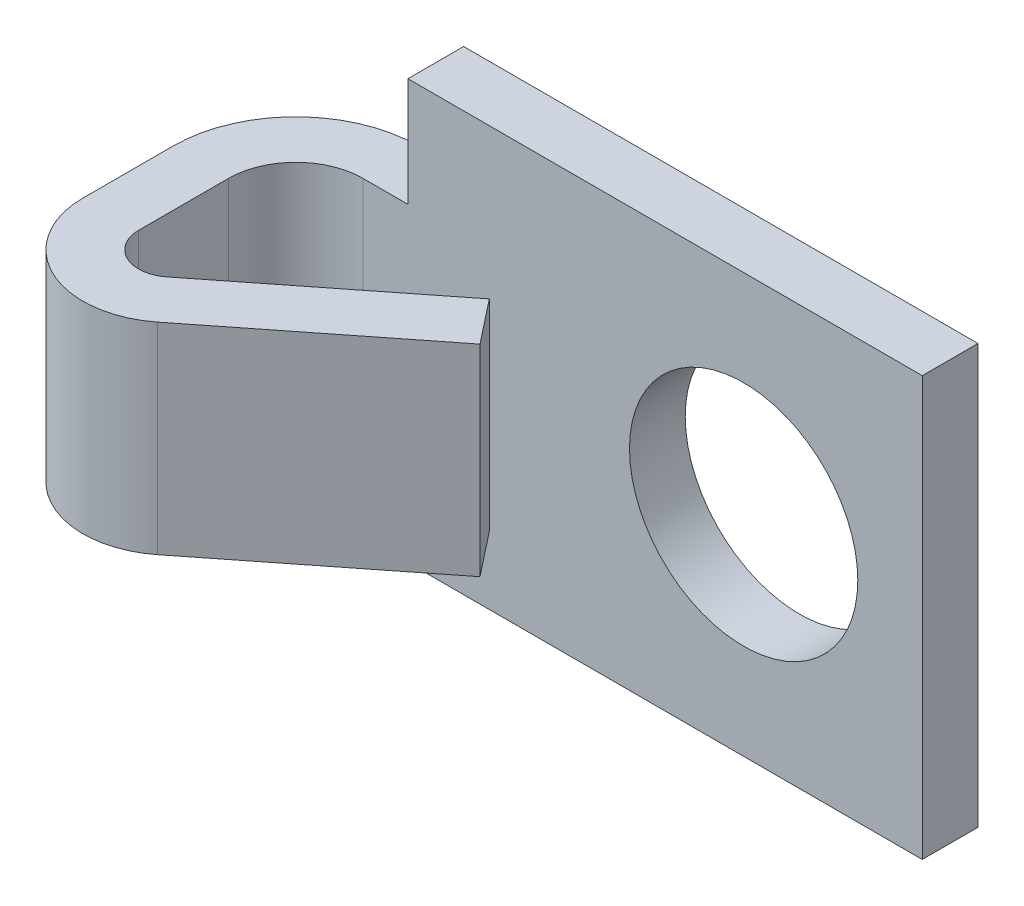
ISO-10303-21;
HEADER;
FILE_DESCRIPTION(('STEP AP214'),'2;1');
FILE_NAME('part.step','',(''),(''),'','','');
FILE_SCHEMA(('AUTOMOTIVE_DESIGN { 1 0 10303 214 1 1 1 1 }'));
ENDSEC;
DATA;
#1=APPLICATION_CONTEXT('core data for automotive mechanical design processes');
#2=APPLICATION_PROTOCOL_DEFINITION('international standard','automotive_design',2000,#1);
#3=PRODUCT_CONTEXT('',#1,'mechanical');
#4=PRODUCT('Part','Part','',(#3));
#5=PRODUCT_RELATED_PRODUCT_CATEGORY('part','',(#4));
#6=PRODUCT_DEFINITION_FORMATION('','',#4);
#7=PRODUCT_DEFINITION_CONTEXT('part definition',#1,'design');
#8=PRODUCT_DEFINITION('design','',#6,#7);
#9=PRODUCT_DEFINITION_SHAPE('','',#8);
#10=(LENGTH_UNIT() NAMED_UNIT(*) SI_UNIT(.MILLI.,.METRE.));
#11=(NAMED_UNIT(*) PLANE_ANGLE_UNIT() SI_UNIT($,.RADIAN.));
#12=(NAMED_UNIT(*) SI_UNIT($,.STERADIAN.) SOLID_ANGLE_UNIT());
#13=UNCERTAINTY_MEASURE_WITH_UNIT(LENGTH_MEASURE(1.E-05),#10,'distance_accuracy_value','');
#14=(GEOMETRIC_REPRESENTATION_CONTEXT(3) GLOBAL_UNCERTAINTY_ASSIGNED_CONTEXT((#13)) GLOBAL_UNIT_ASSIGNED_CONTEXT((#10,
#11,#12)) REPRESENTATION_CONTEXT('',''));
#15=CARTESIAN_POINT('',(0.,0.,0.));
#16=DIRECTION('',(0.,0.,1.));
#17=DIRECTION('',(1.,0.,0.));
#18=AXIS2_PLACEMENT_3D('',#15,#16,#17);
#19=CARTESIAN_POINT('',(-15.6718,-3.81000000000006,8.05180000000003));
#20=DIRECTION('',(0.,1.,0.));
#21=DIRECTION('',(0.,0.,1.));
#22=AXIS2_PLACEMENT_3D('',#19,#20,#21);
#23=CYLINDRICAL_SURFACE('',#22,1.27);
#24=CARTESIAN_POINT('',(-15.6718,-3.81000000000006,8.05180000000003));
#25=DIRECTION('',(0.,1.,0.));
#26=DIRECTION('',(0.,0.,1.));
#27=AXIS2_PLACEMENT_3D('',#24,#25,#26);
#28=CIRCLE('',#27,1.27);
#29=CARTESIAN_POINT('',(-16.9418000000001,-3.81000000000006,8.05180000000003));
#30=VERTEX_POINT('',#29);
#31=CARTESIAN_POINT('',(-14.8854939044228,-3.81000000000006,9.04910773789144));
#32=VERTEX_POINT('',#31);
#33=EDGE_CURVE('E157',#30,#32,#28,.T.);
#34=ORIENTED_EDGE('',*,*,#33,.F.);
#35=DIRECTION('',(0.,-1.,0.));
#36=VECTOR('',#35,1.);
#37=CARTESIAN_POINT('',(-16.9418000000001,3.80999999999992,8.05180000000008));
#38=LINE('',#37,#36);
#39=CARTESIAN_POINT('',(-16.9418000000001,3.80999999999991,8.05180000000008));
#40=VERTEX_POINT('',#39);
#41=EDGE_CURVE('E182',#40,#30,#38,.T.);
#42=ORIENTED_EDGE('',*,*,#41,.F.);
#43=CARTESIAN_POINT('',(-15.6718,3.8099999999999,8.05180000000008));
#44=DIRECTION('',(0.,1.,0.));
#45=DIRECTION('',(0.,0.,1.));
#46=AXIS2_PLACEMENT_3D('',#43,#44,#45);
#47=CIRCLE('',#46,1.27);
#48=CARTESIAN_POINT('',(-14.8854939044228,3.80999999999989,9.04910773789149));
#49=VERTEX_POINT('',#48);
#50=EDGE_CURVE('E189',#49,#40,#47,.F.);
#51=ORIENTED_EDGE('',*,*,#50,.F.);
#52=DIRECTION('',(0.,1.,0.));
#53=VECTOR('',#52,1.);
#54=CARTESIAN_POINT('',(-14.8854939044228,-3.81000000000006,9.04910773789143));
#55=LINE('',#54,#53);
#56=EDGE_CURVE('E38',#32,#49,#55,.T.);
#57=ORIENTED_EDGE('',*,*,#56,.F.);
#58=EDGE_LOOP('',(#34,#42,#51,#57));
#59=FACE_BOUND('',#58,.T.);
#60=ADVANCED_FACE('F34',(#59),#23,.F.);
#61=CARTESIAN_POINT('',(-14.8854939044228,-3.81000000000006,9.04910773789143));
#62=DIRECTION('',(-0.619138657934842,0.,-0.785281683379055));
#63=DIRECTION('',(0.,1.,0.));
#64=AXIS2_PLACEMENT_3D('',#61,#62,#63);
#65=PLANE('',#64);
#66=DIRECTION('',(0.785281683379055,0.,-0.619138657934842));
#67=VECTOR('',#66,1.);
#68=CARTESIAN_POINT('',(-14.8854939044228,-3.81000000000006,9.04910773789144));
#69=LINE('',#68,#67);
#70=CARTESIAN_POINT('',(-8.06166811865821,-3.81000000000003,3.66900728680263));
#71=VERTEX_POINT('',#70);
#72=EDGE_CURVE('E148',#32,#71,#69,.T.);
#73=ORIENTED_EDGE('',*,*,#72,.F.);
#74=ORIENTED_EDGE('',*,*,#56,.T.);
#75=DIRECTION('',(-0.785281683379055,0.,0.619138657934842));
#76=VECTOR('',#75,1.);
#77=CARTESIAN_POINT('',(-8.0616681186582,3.80999999999994,3.66900728680267));
#78=LINE('',#77,#76);
#79=CARTESIAN_POINT('',(-8.06166811865821,3.80999999999994,3.66900728680268));
#80=VERTEX_POINT('',#79);
#81=EDGE_CURVE('E164',#80,#49,#78,.T.);
#82=ORIENTED_EDGE('',*,*,#81,.F.);
#83=DIRECTION('',(0.,-1.,0.));
#84=VECTOR('',#83,1.);
#85=CARTESIAN_POINT('',(-8.06166811865821,3.80999999999995,3.66900728680268));
#86=LINE('',#85,#84);
#87=EDGE_CURVE('E161',#71,#80,#86,.F.);
#88=ORIENTED_EDGE('',*,*,#87,.F.);
#89=EDGE_LOOP('',(#73,#74,#82,#88));
#90=FACE_BOUND('',#89,.T.);
#91=ADVANCED_FACE('F162',(#90),#65,.T.);
#92=CARTESIAN_POINT('',(-6.7564,3.80999999999994,5.32453813170244));
#93=DIRECTION('',(0.785281683379066,0.,-0.619138657934828));
#94=DIRECTION('',(0.,-1.,0.));
#95=AXIS2_PLACEMENT_3D('',#92,#93,#94);
#96=PLANE('',#95);
#97=DIRECTION('',(0.619138657934827,0.,0.785281683379066));
#98=VECTOR('',#97,1.);
#99=CARTESIAN_POINT('',(-8.06166811865821,-3.81000000000003,3.66900728680263));
#100=LINE('',#99,#98);
#101=CARTESIAN_POINT('',(-6.7564,-3.81000000000004,5.32453813170239));
#102=VERTEX_POINT('',#101);
#103=EDGE_CURVE('E153',#71,#102,#100,.T.);
#104=ORIENTED_EDGE('',*,*,#103,.F.);
#105=ORIENTED_EDGE('',*,*,#87,.T.);
#106=DIRECTION('',(-0.619138657934828,0.,-0.785281683379066));
#107=VECTOR('',#106,1.);
#108=CARTESIAN_POINT('',(-6.75640000000001,3.80999999999993,5.32453813170244));
#109=LINE('',#108,#107);
#110=CARTESIAN_POINT('',(-6.7564,3.80999999999993,5.32453813170244));
#111=VERTEX_POINT('',#110);
#112=EDGE_CURVE('E192',#111,#80,#109,.T.);
#113=ORIENTED_EDGE('',*,*,#112,.F.);
#114=DIRECTION('',(0.,-1.,0.));
#115=VECTOR('',#114,1.);
#116=CARTESIAN_POINT('',(-6.7564,3.80999999999994,5.32453813170244));
#117=LINE('',#116,#115);
#118=EDGE_CURVE('E168',#102,#111,#117,.F.);
#119=ORIENTED_EDGE('',*,*,#118,.F.);
#120=EDGE_LOOP('',(#104,#105,#113,#119));
#121=FACE_BOUND('',#120,.T.);
#122=ADVANCED_FACE('F169',(#121),#96,.T.);
#123=CARTESIAN_POINT('',(-13.5802257857645,3.8099999999999,10.7046385827912));
#124=DIRECTION('',(0.619138657934841,0.,0.785281683379056));
#125=DIRECTION('',(0.,-1.,0.));
#126=AXIS2_PLACEMENT_3D('',#123,#124,#125);
#127=PLANE('',#126);
#128=DIRECTION('',(-0.785281683379056,0.,0.619138657934841));
#129=VECTOR('',#128,1.);
#130=CARTESIAN_POINT('',(-6.7564,-3.81000000000004,5.32453813170238));
#131=LINE('',#130,#129);
#132=CARTESIAN_POINT('',(-13.5802257857645,-3.81000000000008,10.7046385827912));
#133=VERTEX_POINT('',#132);
#134=EDGE_CURVE('E171',#102,#133,#131,.T.);
#135=ORIENTED_EDGE('',*,*,#134,.F.);
#136=ORIENTED_EDGE('',*,*,#118,.T.);
#137=DIRECTION('',(0.785281683379056,0.,-0.619138657934841));
#138=VECTOR('',#137,1.);
#139=CARTESIAN_POINT('',(-13.5802257857645,3.80999999999988,10.7046385827912));
#140=LINE('',#139,#138);
#141=CARTESIAN_POINT('',(-13.5802257857645,3.80999999999988,10.7046385827912));
#142=VERTEX_POINT('',#141);
#143=EDGE_CURVE('E194',#142,#111,#140,.T.);
#144=ORIENTED_EDGE('',*,*,#143,.F.);
#145=DIRECTION('',(0.,-1.,0.));
#146=VECTOR('',#145,1.);
#147=CARTESIAN_POINT('',(-13.5802257857646,3.8099999999999,10.7046385827912));
#148=LINE('',#147,#146);
#149=EDGE_CURVE('E207',#133,#142,#148,.F.);
#150=ORIENTED_EDGE('',*,*,#149,.F.);
#151=EDGE_LOOP('',(#135,#136,#144,#150));
#152=FACE_BOUND('',#151,.T.);
#153=ADVANCED_FACE('F213',(#152),#127,.T.);
#154=CARTESIAN_POINT('',(-15.6718,3.80999999999992,8.05180000000008));
#155=DIRECTION('',(0.,-1.,0.));
#156=DIRECTION('',(0.,0.,-1.));
#157=AXIS2_PLACEMENT_3D('',#154,#155,#156);
#158=CYLINDRICAL_SURFACE('',#157,3.3782);
#159=CARTESIAN_POINT('',(-15.6718,-3.81000000000006,8.05180000000003));
#160=DIRECTION('',(0.,-1.,0.));
#161=DIRECTION('',(0.,0.,-1.));
#162=AXIS2_PLACEMENT_3D('',#159,#160,#161);
#163=CIRCLE('',#162,3.3782);
#164=CARTESIAN_POINT('',(-19.05,-3.81000000000006,8.05180000000003));
#165=VERTEX_POINT('',#164);
#166=EDGE_CURVE('E173',#133,#165,#163,.T.);
#167=ORIENTED_EDGE('',*,*,#166,.F.);
#168=ORIENTED_EDGE('',*,*,#149,.T.);
#169=CARTESIAN_POINT('',(-15.6718,3.8099999999999,8.05180000000008));
#170=DIRECTION('',(0.,-1.,0.));
#171=DIRECTION('',(0.,0.,-1.));
#172=AXIS2_PLACEMENT_3D('',#169,#170,#171);
#173=CIRCLE('',#172,3.3782);
#174=CARTESIAN_POINT('',(-19.05,3.8099999999999,8.05180000000008));
#175=VERTEX_POINT('',#174);
#176=EDGE_CURVE('E197',#175,#142,#173,.F.);
#177=ORIENTED_EDGE('',*,*,#176,.F.);
#178=DIRECTION('',(0.,1.,0.));
#179=VECTOR('',#178,1.);
#180=CARTESIAN_POINT('',(-19.05,-3.81000000000006,8.05180000000003));
#181=LINE('',#180,#179);
#182=EDGE_CURVE('E205',#165,#175,#181,.T.);
#183=ORIENTED_EDGE('',*,*,#182,.F.);
#184=EDGE_LOOP('',(#167,#168,#177,#183));
#185=FACE_BOUND('',#184,.T.);
#186=ADVANCED_FACE('F222',(#185),#158,.T.);
#187=CARTESIAN_POINT('',(-19.05,-3.81000000000006,8.05180000000003));
#188=DIRECTION('',(-1.,0.,0.));
#189=DIRECTION('',(0.,1.,0.));
#190=AXIS2_PLACEMENT_3D('',#187,#188,#189);
#191=PLANE('',#190);
#192=DIRECTION('',(0.,0.,-1.));
#193=VECTOR('',#192,1.);
#194=CARTESIAN_POINT('',(-19.05,-3.81000000000008,11.5937097155975));
#195=LINE('',#194,#193);
#196=CARTESIAN_POINT('',(-19.05,-3.81000000000003,4.64819999999997));
#197=VERTEX_POINT('',#196);
#198=EDGE_CURVE('E225',#165,#197,#195,.T.);
#199=ORIENTED_EDGE('',*,*,#198,.F.);
#200=ORIENTED_EDGE('',*,*,#182,.T.);
#201=DIRECTION('',(0.,0.,-1.));
#202=VECTOR('',#201,1.);
#203=CARTESIAN_POINT('',(-19.05,3.80999999999987,11.5443000000001));
#204=LINE('',#203,#202);
#205=CARTESIAN_POINT('',(-19.05,3.80999999999993,4.64820000000003));
#206=VERTEX_POINT('',#205);
#207=EDGE_CURVE('E200',#206,#175,#204,.F.);
#208=ORIENTED_EDGE('',*,*,#207,.F.);
#209=DIRECTION('',(0.,-1.,0.));
#210=VECTOR('',#209,1.);
#211=CARTESIAN_POINT('',(-19.05,3.80999999999994,4.64820000000003));
#212=LINE('',#211,#210);
#213=EDGE_CURVE('E236',#197,#206,#212,.F.);
#214=ORIENTED_EDGE('',*,*,#213,.F.);
#215=EDGE_LOOP('',(#199,#200,#208,#214));
#216=FACE_BOUND('',#215,.T.);
#217=ADVANCED_FACE('F371',(#216),#191,.T.);
#218=CARTESIAN_POINT('',(-19.05,3.80999999999987,11.5443000000001));
#219=DIRECTION('',(0.,1.,0.));
#220=DIRECTION('',(1.,0.,0.));
#221=AXIS2_PLACEMENT_3D('',#218,#219,#220);
#222=PLANE('',#221);
#223=CARTESIAN_POINT('',(-14.4018000000001,3.80999999999994,4.64820000000003));
#224=DIRECTION('',(0.,1.,0.));
#225=DIRECTION('',(0.,0.,1.));
#226=AXIS2_PLACEMENT_3D('',#223,#224,#225);
#227=CIRCLE('',#226,2.54);
#228=CARTESIAN_POINT('',(-14.4018000000001,3.80999999999996,2.10820000000004));
#229=VERTEX_POINT('',#228);
#230=CARTESIAN_POINT('',(-16.9418000000001,3.80999999999994,4.64820000000004));
#231=VERTEX_POINT('',#230);
#232=EDGE_CURVE('E244',#229,#231,#227,.T.);
#233=ORIENTED_EDGE('',*,*,#232,.F.);
#234=DIRECTION('',(1.,0.,0.));
#235=VECTOR('',#234,1.);
#236=CARTESIAN_POINT('',(-19.05,3.80999999999996,2.10820000000004));
#237=LINE('',#236,#235);
#238=CARTESIAN_POINT('',(-12.7,3.80999999999996,2.10820000000004));
#239=VERTEX_POINT('',#238);
#240=EDGE_CURVE('E187',#229,#239,#237,.T.);
#241=ORIENTED_EDGE('',*,*,#240,.T.);
#242=DIRECTION('',(0.,0.,-1.));
#243=VECTOR('',#242,1.);
#244=CARTESIAN_POINT('',(-12.7,3.80999999999996,2.10820000000003));
#245=LINE('',#244,#243);
#246=CARTESIAN_POINT('',(-12.7,3.80999999999998,0.));
#247=VERTEX_POINT('',#246);
#248=EDGE_CURVE('E241',#247,#239,#245,.F.);
#249=ORIENTED_EDGE('',*,*,#248,.F.);
#250=DIRECTION('',(1.,0.,0.));
#251=VECTOR('',#250,1.);
#252=CARTESIAN_POINT('',(-19.05,3.80999999999998,0.));
#253=LINE('',#252,#251);
#254=CARTESIAN_POINT('',(-14.4018,3.80999999999997,0.));
#255=VERTEX_POINT('',#254);
#256=EDGE_CURVE('E203',#247,#255,#253,.F.);
#257=ORIENTED_EDGE('',*,*,#256,.T.);
#258=CARTESIAN_POINT('',(-14.4018,3.80999999999993,4.64820000000003));
#259=DIRECTION('',(0.,-1.,0.));
#260=DIRECTION('',(0.,0.,-1.));
#261=AXIS2_PLACEMENT_3D('',#258,#259,#260);
#262=CIRCLE('',#261,4.6482);
#263=EDGE_CURVE('E230',#206,#255,#262,.T.);
#264=ORIENTED_EDGE('',*,*,#263,.F.);
#265=ORIENTED_EDGE('',*,*,#207,.T.);
#266=ORIENTED_EDGE('',*,*,#176,.T.);
#267=ORIENTED_EDGE('',*,*,#143,.T.);
#268=ORIENTED_EDGE('',*,*,#112,.T.);
#269=ORIENTED_EDGE('',*,*,#81,.T.);
#270=ORIENTED_EDGE('',*,*,#50,.T.);
#271=DIRECTION('',(0.,0.,-1.));
#272=VECTOR('',#271,1.);
#273=CARTESIAN_POINT('',(-16.9418000000001,3.80999999999991,8.05180000000008));
#274=LINE('',#273,#272);
#275=EDGE_CURVE('E184',#231,#40,#274,.F.);
#276=ORIENTED_EDGE('',*,*,#275,.F.);
#277=EDGE_LOOP('',(#233,#241,#249,#257,#264,#265,#266,#267,#268,#269,#270,#276));
#278=FACE_BOUND('',#277,.T.);
#279=ADVANCED_FACE('F217',(#278),#222,.T.);
#280=CARTESIAN_POINT('',(-16.9418000000001,3.80999999999992,8.05180000000008));
#281=DIRECTION('',(1.,0.,0.));
#282=DIRECTION('',(0.,-1.,0.));
#283=AXIS2_PLACEMENT_3D('',#280,#281,#282);
#284=PLANE('',#283);
#285=DIRECTION('',(0.,0.,-1.));
#286=VECTOR('',#285,1.);
#287=CARTESIAN_POINT('',(-16.9418000000001,-3.81000000000008,11.5937097155975));
#288=LINE('',#287,#286);
#289=CARTESIAN_POINT('',(-16.9418000000001,-3.81000000000003,4.64819999999997));
#290=VERTEX_POINT('',#289);
#291=EDGE_CURVE('E178',#290,#30,#288,.F.);
#292=ORIENTED_EDGE('',*,*,#291,.F.);
#293=DIRECTION('',(0.,1.,0.));
#294=VECTOR('',#293,1.);
#295=CARTESIAN_POINT('',(-16.9418000000001,-3.81000000000003,4.64819999999998));
#296=LINE('',#295,#294);
#297=EDGE_CURVE('E247',#231,#290,#296,.F.);
#298=ORIENTED_EDGE('',*,*,#297,.F.);
#299=ORIENTED_EDGE('',*,*,#275,.T.);
#300=ORIENTED_EDGE('',*,*,#41,.T.);
#301=EDGE_LOOP('',(#292,#298,#299,#300));
#302=FACE_BOUND('',#301,.T.);
#303=ADVANCED_FACE('F326',(#302),#284,.T.);
#304=CARTESIAN_POINT('',(-6.7564,-3.81000000000008,11.5937097155975));
#305=DIRECTION('',(0.,-1.,0.));
#306=DIRECTION('',(-1.,0.,0.));
#307=AXIS2_PLACEMENT_3D('',#304,#305,#306);
#308=PLANE('',#307);
#309=CARTESIAN_POINT('',(-14.4018,-3.81000000000003,4.64819999999997));
#310=DIRECTION('',(0.,-1.,0.));
#311=DIRECTION('',(0.,0.,-1.));
#312=AXIS2_PLACEMENT_3D('',#309,#310,#311);
#313=CIRCLE('',#312,4.6482);
#314=CARTESIAN_POINT('',(-14.4018,-3.81,0.));
#315=VERTEX_POINT('',#314);
#316=EDGE_CURVE('E233',#315,#197,#313,.F.);
#317=ORIENTED_EDGE('',*,*,#316,.F.);
#318=DIRECTION('',(-1.,0.,0.));
#319=VECTOR('',#318,1.);
#320=CARTESIAN_POINT('',(-6.7564,-3.81,0.));
#321=LINE('',#320,#319);
#322=CARTESIAN_POINT('',(-12.7,-3.81,0.));
#323=VERTEX_POINT('',#322);
#324=EDGE_CURVE('E226',#315,#323,#321,.F.);
#325=ORIENTED_EDGE('',*,*,#324,.T.);
#326=DIRECTION('',(0.,0.,-1.));
#327=VECTOR('',#326,1.);
#328=CARTESIAN_POINT('',(-12.7,-3.81000000000002,2.10819999999997));
#329=LINE('',#328,#327);
#330=CARTESIAN_POINT('',(-12.7,-3.81000000000002,2.10819999999998));
#331=VERTEX_POINT('',#330);
#332=EDGE_CURVE('E253',#331,#323,#329,.T.);
#333=ORIENTED_EDGE('',*,*,#332,.F.);
#334=DIRECTION('',(-1.,0.,0.));
#335=VECTOR('',#334,1.);
#336=CARTESIAN_POINT('',(-6.7564,-3.81000000000002,2.10819999999998));
#337=LINE('',#336,#335);
#338=CARTESIAN_POINT('',(-14.4018000000001,-3.81000000000002,2.10819999999998));
#339=VERTEX_POINT('',#338);
#340=EDGE_CURVE('E180',#331,#339,#337,.T.);
#341=ORIENTED_EDGE('',*,*,#340,.T.);
#342=CARTESIAN_POINT('',(-14.4018000000001,-3.81000000000003,4.64819999999997));
#343=DIRECTION('',(0.,1.,0.));
#344=DIRECTION('',(0.,0.,1.));
#345=AXIS2_PLACEMENT_3D('',#342,#343,#344);
#346=CIRCLE('',#345,2.54);
#347=EDGE_CURVE('E250',#290,#339,#346,.F.);
#348=ORIENTED_EDGE('',*,*,#347,.F.);
#349=ORIENTED_EDGE('',*,*,#291,.T.);
#350=ORIENTED_EDGE('',*,*,#33,.T.);
#351=ORIENTED_EDGE('',*,*,#72,.T.);
#352=ORIENTED_EDGE('',*,*,#103,.T.);
#353=ORIENTED_EDGE('',*,*,#134,.T.);
#354=ORIENTED_EDGE('',*,*,#166,.T.);
#355=ORIENTED_EDGE('',*,*,#198,.T.);
#356=EDGE_LOOP('',(#317,#325,#333,#341,#348,#349,#350,#351,#352,#353,#354,#355));
#357=FACE_BOUND('',#356,.T.);
#358=ADVANCED_FACE('F151',(#357),#308,.T.);
#359=CARTESIAN_POINT('',(-14.4018,3.80999999999994,4.64820000000003));
#360=DIRECTION('',(0.,-1.,0.));
#361=DIRECTION('',(0.,0.,-1.));
#362=AXIS2_PLACEMENT_3D('',#359,#360,#361);
#363=CYLINDRICAL_SURFACE('',#362,4.6482);
#364=ORIENTED_EDGE('',*,*,#316,.T.);
#365=ORIENTED_EDGE('',*,*,#213,.T.);
#366=ORIENTED_EDGE('',*,*,#263,.T.);
#367=DIRECTION('',(0.,1.,0.));
#368=VECTOR('',#367,1.);
#369=CARTESIAN_POINT('',(-14.4018,-7.92480000000003,0.));
#370=LINE('',#369,#368);
#371=EDGE_CURVE('E268',#315,#255,#370,.T.);
#372=ORIENTED_EDGE('',*,*,#371,.F.);
#373=EDGE_LOOP('',(#364,#365,#366,#372));
#374=FACE_BOUND('',#373,.T.);
#375=ADVANCED_FACE('F361',(#374),#363,.T.);
#376=CARTESIAN_POINT('',(-12.7,7.92479999999998,0.));
#377=DIRECTION('',(0.,1.,0.));
#378=DIRECTION('',(0.,0.,1.));
#379=AXIS2_PLACEMENT_3D('',#376,#377,#378);
#380=PLANE('',#379);
#381=DIRECTION('',(0.,0.,1.));
#382=VECTOR('',#381,1.);
#383=CARTESIAN_POINT('',(6.7564,7.92479999999996,2.10820000000007));
#384=LINE('',#383,#382);
#385=CARTESIAN_POINT('',(6.7564,7.92479999999998,0.));
#386=VERTEX_POINT('',#385);
#387=CARTESIAN_POINT('',(6.7564,7.92479999999996,2.10820000000007));
#388=VERTEX_POINT('',#387);
#389=EDGE_CURVE('E51',#386,#388,#384,.T.);
#390=ORIENTED_EDGE('',*,*,#389,.F.);
#391=DIRECTION('',(1.,0.,0.));
#392=VECTOR('',#391,1.);
#393=CARTESIAN_POINT('',(-14.4018,7.92479999999998,0.));
#394=LINE('',#393,#392);
#395=CARTESIAN_POINT('',(-12.7,7.92479999999998,0.));
#396=VERTEX_POINT('',#395);
#397=EDGE_CURVE('E260',#396,#386,#394,.T.);
#398=ORIENTED_EDGE('',*,*,#397,.F.);
#399=DIRECTION('',(0.,0.,-1.));
#400=VECTOR('',#399,1.);
#401=CARTESIAN_POINT('',(-12.7,7.92479999999996,2.10820000000006));
#402=LINE('',#401,#400);
#403=CARTESIAN_POINT('',(-12.7,7.92479999999996,2.10820000000007));
#404=VERTEX_POINT('',#403);
#405=EDGE_CURVE('E239',#404,#396,#402,.T.);
#406=ORIENTED_EDGE('',*,*,#405,.F.);
#407=DIRECTION('',(1.,0.,0.));
#408=VECTOR('',#407,1.);
#409=CARTESIAN_POINT('',(-14.4018000000001,7.92479999999996,2.10820000000007));
#410=LINE('',#409,#408);
#411=EDGE_CURVE('E271',#388,#404,#410,.F.);
#412=ORIENTED_EDGE('',*,*,#411,.F.);
#413=EDGE_LOOP('',(#390,#398,#406,#412));
#414=FACE_BOUND('',#413,.T.);
#415=ADVANCED_FACE('F313',(#414),#380,.T.);
#416=CARTESIAN_POINT('',(-12.7,7.92479999999996,2.10820000000006));
#417=DIRECTION('',(-1.,0.,0.));
#418=DIRECTION('',(0.,0.,-1.));
#419=AXIS2_PLACEMENT_3D('',#416,#417,#418);
#420=PLANE('',#419);
#421=ORIENTED_EDGE('',*,*,#248,.T.);
#422=DIRECTION('',(0.,-1.,0.));
#423=VECTOR('',#422,1.);
#424=CARTESIAN_POINT('',(-12.7,7.92479999999996,2.10820000000007));
#425=LINE('',#424,#423);
#426=EDGE_CURVE('E273',#404,#239,#425,.T.);
#427=ORIENTED_EDGE('',*,*,#426,.F.);
#428=ORIENTED_EDGE('',*,*,#405,.T.);
#429=DIRECTION('',(0.,1.,0.));
#430=VECTOR('',#429,1.);
#431=CARTESIAN_POINT('',(-12.7,-7.92480000000003,0.));
#432=LINE('',#431,#430);
#433=EDGE_CURVE('E257',#247,#396,#432,.T.);
#434=ORIENTED_EDGE('',*,*,#433,.F.);
#435=EDGE_LOOP('',(#421,#427,#428,#434));
#436=FACE_BOUND('',#435,.T.);
#437=ADVANCED_FACE('F317',(#436),#420,.T.);
#438=CARTESIAN_POINT('',(-14.4018000000001,-3.81000000000003,4.64819999999997));
#439=DIRECTION('',(0.,1.,0.));
#440=DIRECTION('',(0.,0.,1.));
#441=AXIS2_PLACEMENT_3D('',#438,#439,#440);
#442=CYLINDRICAL_SURFACE('',#441,2.54);
#443=ORIENTED_EDGE('',*,*,#347,.T.);
#444=DIRECTION('',(0.,-1.,0.));
#445=VECTOR('',#444,1.);
#446=CARTESIAN_POINT('',(-14.4018000000001,7.92479999999996,2.10820000000007));
#447=LINE('',#446,#445);
#448=EDGE_CURVE('E276',#229,#339,#447,.T.);
#449=ORIENTED_EDGE('',*,*,#448,.F.);
#450=ORIENTED_EDGE('',*,*,#232,.T.);
#451=ORIENTED_EDGE('',*,*,#297,.T.);
#452=EDGE_LOOP('',(#443,#449,#450,#451));
#453=FACE_BOUND('',#452,.T.);
#454=ADVANCED_FACE('F323',(#453),#442,.F.);
#455=CARTESIAN_POINT('',(-12.7,-3.81000000000002,2.10819999999997));
#456=DIRECTION('',(-1.,0.,0.));
#457=DIRECTION('',(0.,0.,-1.));
#458=AXIS2_PLACEMENT_3D('',#455,#456,#457);
#459=PLANE('',#458);
#460=DIRECTION('',(0.,0.,-1.));
#461=VECTOR('',#460,1.);
#462=CARTESIAN_POINT('',(-12.7,-7.92480000000004,2.10819999999995));
#463=LINE('',#462,#461);
#464=CARTESIAN_POINT('',(-12.7,-7.92480000000004,2.10819999999995));
#465=VERTEX_POINT('',#464);
#466=CARTESIAN_POINT('',(-12.7,-7.92480000000003,0.));
#467=VERTEX_POINT('',#466);
#468=EDGE_CURVE('E60',#465,#467,#463,.T.);
#469=ORIENTED_EDGE('',*,*,#468,.F.);
#470=DIRECTION('',(0.,-1.,0.));
#471=VECTOR('',#470,1.);
#472=CARTESIAN_POINT('',(-12.7,7.92479999999996,2.10820000000007));
#473=LINE('',#472,#471);
#474=EDGE_CURVE('E279',#331,#465,#473,.T.);
#475=ORIENTED_EDGE('',*,*,#474,.F.);
#476=ORIENTED_EDGE('',*,*,#332,.T.);
#477=DIRECTION('',(0.,1.,0.));
#478=VECTOR('',#477,1.);
#479=CARTESIAN_POINT('',(-12.7,-7.92480000000003,0.));
#480=LINE('',#479,#478);
#481=EDGE_CURVE('E265',#467,#323,#480,.T.);
#482=ORIENTED_EDGE('',*,*,#481,.F.);
#483=EDGE_LOOP('',(#469,#475,#476,#482));
#484=FACE_BOUND('',#483,.T.);
#485=ADVANCED_FACE('F305',(#484),#459,.T.);
#486=CARTESIAN_POINT('',(-12.7,-7.92480000000004,2.10819999999995));
#487=DIRECTION('',(0.,-1.,0.));
#488=DIRECTION('',(0.,0.,-1.));
#489=AXIS2_PLACEMENT_3D('',#486,#487,#488);
#490=PLANE('',#489);
#491=DIRECTION('',(0.,0.,1.));
#492=VECTOR('',#491,1.);
#493=CARTESIAN_POINT('',(6.7564,-7.92480000000005,2.10819999999996));
#494=LINE('',#493,#492);
#495=CARTESIAN_POINT('',(6.7564,-7.92480000000004,0.));
#496=VERTEX_POINT('',#495);
#497=CARTESIAN_POINT('',(6.7564,-7.92480000000005,2.10819999999996));
#498=VERTEX_POINT('',#497);
#499=EDGE_CURVE('E290',#496,#498,#494,.T.);
#500=ORIENTED_EDGE('',*,*,#499,.T.);
#501=DIRECTION('',(1.,0.,0.));
#502=VECTOR('',#501,1.);
#503=CARTESIAN_POINT('',(-14.4018000000001,-7.92480000000004,2.10819999999995));
#504=LINE('',#503,#502);
#505=EDGE_CURVE('E282',#465,#498,#504,.T.);
#506=ORIENTED_EDGE('',*,*,#505,.F.);
#507=ORIENTED_EDGE('',*,*,#468,.T.);
#508=DIRECTION('',(1.,0.,0.));
#509=VECTOR('',#508,1.);
#510=CARTESIAN_POINT('',(-14.4018,-7.92480000000003,0.));
#511=LINE('',#510,#509);
#512=EDGE_CURVE('E263',#496,#467,#511,.F.);
#513=ORIENTED_EDGE('',*,*,#512,.F.);
#514=EDGE_LOOP('',(#500,#506,#507,#513));
#515=FACE_BOUND('',#514,.T.);
#516=ADVANCED_FACE('F297',(#515),#490,.T.);
#517=CARTESIAN_POINT('',(-14.4018,-7.92480000000003,0.));
#518=DIRECTION('',(0.,0.,-1.));
#519=DIRECTION('',(0.,1.,0.));
#520=AXIS2_PLACEMENT_3D('',#517,#518,#519);
#521=PLANE('',#520);
#522=DIRECTION('',(0.,1.,0.));
#523=VECTOR('',#522,1.);
#524=CARTESIAN_POINT('',(6.7564,-7.92480000000004,0.));
#525=LINE('',#524,#523);
#526=EDGE_CURVE('E287',#496,#386,#525,.T.);
#527=ORIENTED_EDGE('',*,*,#526,.F.);
#528=ORIENTED_EDGE('',*,*,#512,.T.);
#529=ORIENTED_EDGE('',*,*,#481,.T.);
#530=ORIENTED_EDGE('',*,*,#324,.F.);
#531=ORIENTED_EDGE('',*,*,#371,.T.);
#532=ORIENTED_EDGE('',*,*,#256,.F.);
#533=ORIENTED_EDGE('',*,*,#433,.T.);
#534=ORIENTED_EDGE('',*,*,#397,.T.);
#535=EDGE_LOOP('',(#527,#528,#529,#530,#531,#532,#533,#534));
#536=FACE_BOUND('',#535,.T.);
#537=CARTESIAN_POINT('',(0.,0.,0.));
#538=DIRECTION('',(0.,0.,-1.));
#539=DIRECTION('',(1.,0.,0.));
#540=AXIS2_PLACEMENT_3D('',#537,#538,#539);
#541=CIRCLE('',#540,4.318);
#542=CARTESIAN_POINT('',(4.318,0.,0.));
#543=VERTEX_POINT('',#542);
#544=EDGE_CURVE('E43',#543,#543,#541,.T.);
#545=ORIENTED_EDGE('',*,*,#544,.F.);
#546=EDGE_LOOP('',(#545));
#547=FACE_BOUND('',#546,.T.);
#548=ADVANCED_FACE('F307',(#536,#547),#521,.T.);
#549=CARTESIAN_POINT('',(-14.4018000000001,7.92479999999996,2.10820000000007));
#550=DIRECTION('',(0.,0.,1.));
#551=DIRECTION('',(0.,-1.,0.));
#552=AXIS2_PLACEMENT_3D('',#549,#550,#551);
#553=PLANE('',#552);
#554=DIRECTION('',(0.,1.,0.));
#555=VECTOR('',#554,1.);
#556=CARTESIAN_POINT('',(6.7564,-7.92480000000005,2.10819999999996));
#557=LINE('',#556,#555);
#558=EDGE_CURVE('E289',#498,#388,#557,.T.);
#559=ORIENTED_EDGE('',*,*,#558,.T.);
#560=ORIENTED_EDGE('',*,*,#411,.T.);
#561=ORIENTED_EDGE('',*,*,#426,.T.);
#562=ORIENTED_EDGE('',*,*,#240,.F.);
#563=ORIENTED_EDGE('',*,*,#448,.T.);
#564=ORIENTED_EDGE('',*,*,#340,.F.);
#565=ORIENTED_EDGE('',*,*,#474,.T.);
#566=ORIENTED_EDGE('',*,*,#505,.T.);
#567=EDGE_LOOP('',(#559,#560,#561,#562,#563,#564,#565,#566));
#568=FACE_BOUND('',#567,.T.);
#569=CARTESIAN_POINT('',(0.,0.,2.10820000000001));
#570=DIRECTION('',(0.,0.,-1.));
#571=DIRECTION('',(1.,0.,0.));
#572=AXIS2_PLACEMENT_3D('',#569,#570,#571);
#573=CIRCLE('',#572,4.318);
#574=CARTESIAN_POINT('',(4.318,0.,2.10820000000001));
#575=VERTEX_POINT('',#574);
#576=EDGE_CURVE('E11',#575,#575,#573,.F.);
#577=ORIENTED_EDGE('',*,*,#576,.F.);
#578=EDGE_LOOP('',(#577));
#579=FACE_BOUND('',#578,.T.);
#580=ADVANCED_FACE('F301',(#568,#579),#553,.T.);
#581=CARTESIAN_POINT('',(0.,0.,2.10820000000001));
#582=DIRECTION('',(0.,0.,-1.));
#583=DIRECTION('',(1.,0.,0.));
#584=AXIS2_PLACEMENT_3D('',#581,#582,#583);
#585=CYLINDRICAL_SURFACE('',#584,4.318);
#586=ORIENTED_EDGE('',*,*,#544,.T.);
#587=EDGE_LOOP('',(#586));
#588=FACE_BOUND('',#587,.T.);
#589=ORIENTED_EDGE('',*,*,#576,.T.);
#590=EDGE_LOOP('',(#589));
#591=FACE_BOUND('',#590,.T.);
#592=ADVANCED_FACE('F36',(#588,#591),#585,.F.);
#593=CARTESIAN_POINT('',(6.7564,-7.92480000000005,2.10819999999996));
#594=DIRECTION('',(-1.,0.,0.));
#595=DIRECTION('',(0.,0.,1.));
#596=AXIS2_PLACEMENT_3D('',#593,#594,#595);
#597=PLANE('',#596);
#598=ORIENTED_EDGE('',*,*,#389,.T.);
#599=ORIENTED_EDGE('',*,*,#558,.F.);
#600=ORIENTED_EDGE('',*,*,#499,.F.);
#601=ORIENTED_EDGE('',*,*,#526,.T.);
#602=EDGE_LOOP('',(#598,#599,#600,#601));
#603=FACE_BOUND('',#602,.T.);
#604=ADVANCED_FACE('F311',(#603),#597,.F.);
#605=CLOSED_SHELL('',(#60,#91,#122,#153,#186,#217,#279,#303,#358,#375,#415,#437,#454,#485,#516,
#548,#580,#592,#604));
#606=MANIFOLD_SOLID_BREP('B2',#605);
#607=ADVANCED_BREP_SHAPE_REPRESENTATION('',(#18,#606),#14);
#608=SHAPE_DEFINITION_REPRESENTATION(#9,#607);
ENDSEC;
END-ISO-10303-21;
